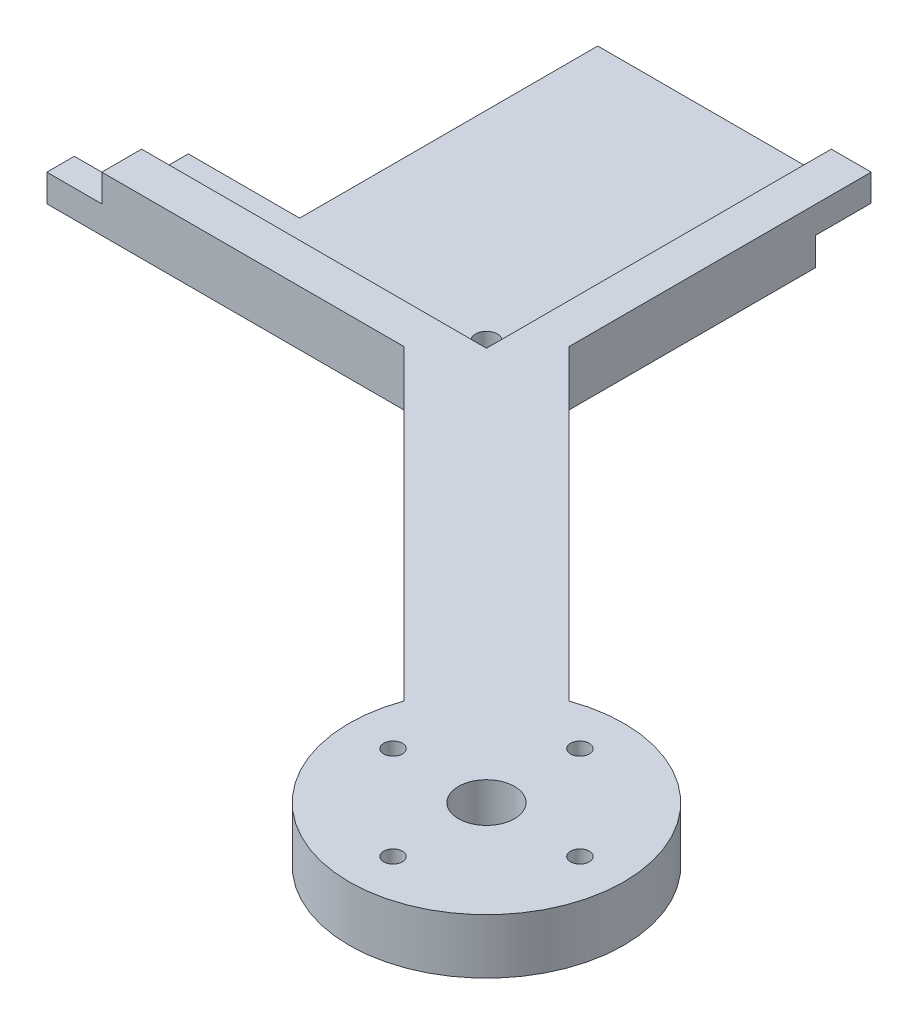
ISO-10303-21;
HEADER;
FILE_DESCRIPTION(('STEP AP214'),'2;1');
FILE_NAME('part.step','',(''),(''),'','','');
FILE_SCHEMA(('AUTOMOTIVE_DESIGN { 1 0 10303 214 1 1 1 1 }'));
ENDSEC;
DATA;
#1=APPLICATION_CONTEXT('core data for automotive mechanical design processes');
#2=APPLICATION_PROTOCOL_DEFINITION('international standard','automotive_design',2000,#1);
#3=PRODUCT_CONTEXT('',#1,'mechanical');
#4=PRODUCT('Part','Part','',(#3));
#5=PRODUCT_RELATED_PRODUCT_CATEGORY('part','',(#4));
#6=PRODUCT_DEFINITION_FORMATION('','',#4);
#7=PRODUCT_DEFINITION_CONTEXT('part definition',#1,'design');
#8=PRODUCT_DEFINITION('design','',#6,#7);
#9=PRODUCT_DEFINITION_SHAPE('','',#8);
#10=(LENGTH_UNIT() NAMED_UNIT(*) SI_UNIT(.MILLI.,.METRE.));
#11=(NAMED_UNIT(*) PLANE_ANGLE_UNIT() SI_UNIT($,.RADIAN.));
#12=(NAMED_UNIT(*) SI_UNIT($,.STERADIAN.) SOLID_ANGLE_UNIT());
#13=UNCERTAINTY_MEASURE_WITH_UNIT(LENGTH_MEASURE(1.E-05),#10,'distance_accuracy_value','');
#14=(GEOMETRIC_REPRESENTATION_CONTEXT(3) GLOBAL_UNCERTAINTY_ASSIGNED_CONTEXT((#13)) GLOBAL_UNIT_ASSIGNED_CONTEXT((#10,
#11,#12)) REPRESENTATION_CONTEXT('',''));
#15=CARTESIAN_POINT('',(0.,0.,0.));
#16=DIRECTION('',(0.,0.,1.));
#17=DIRECTION('',(1.,0.,0.));
#18=AXIS2_PLACEMENT_3D('',#15,#16,#17);
#19=CARTESIAN_POINT('',(-70.,-10.01,0.));
#20=DIRECTION('',(0.,0.,1.));
#21=DIRECTION('',(1.,0.,0.));
#22=AXIS2_PLACEMENT_3D('',#19,#20,#21);
#23=PLANE('',#22);
#24=DIRECTION('',(0.,-1.,0.));
#25=VECTOR('',#24,1.);
#26=CARTESIAN_POINT('',(70.,-10.,0.));
#27=LINE('',#26,#25);
#28=CARTESIAN_POINT('',(70.,0.,0.));
#29=VERTEX_POINT('',#28);
#30=CARTESIAN_POINT('',(70.,-4.9,0.));
#31=VERTEX_POINT('',#30);
#32=EDGE_CURVE('E326',#29,#31,#27,.T.);
#33=ORIENTED_EDGE('',*,*,#32,.T.);
#34=DIRECTION('',(1.,0.,0.));
#35=VECTOR('',#34,1.);
#36=CARTESIAN_POINT('',(70.,-4.9,0.));
#37=LINE('',#36,#35);
#38=CARTESIAN_POINT('',(64.9,-4.9,0.));
#39=VERTEX_POINT('',#38);
#40=EDGE_CURVE('E196',#39,#31,#37,.T.);
#41=ORIENTED_EDGE('',*,*,#40,.F.);
#42=DIRECTION('',(0.,1.,0.));
#43=VECTOR('',#42,1.);
#44=CARTESIAN_POINT('',(64.9,-10.,0.));
#45=LINE('',#44,#43);
#46=CARTESIAN_POINT('',(64.9,-10.,0.));
#47=VERTEX_POINT('',#46);
#48=EDGE_CURVE('E409',#47,#39,#45,.T.);
#49=ORIENTED_EDGE('',*,*,#48,.F.);
#50=DIRECTION('',(1.,0.,0.));
#51=VECTOR('',#50,1.);
#52=CARTESIAN_POINT('',(134.350288425444,-10.,0.));
#53=LINE('',#52,#51);
#54=CARTESIAN_POINT('',(30.35,-10.,0.));
#55=VERTEX_POINT('',#54);
#56=EDGE_CURVE('E337',#55,#47,#53,.T.);
#57=ORIENTED_EDGE('',*,*,#56,.F.);
#58=DIRECTION('',(0.,-1.,0.));
#59=VECTOR('',#58,1.);
#60=CARTESIAN_POINT('',(30.35,-10.,0.));
#61=LINE('',#60,#59);
#62=CARTESIAN_POINT('',(30.35,-7.4,0.));
#63=VERTEX_POINT('',#62);
#64=EDGE_CURVE('E430',#63,#55,#61,.T.);
#65=ORIENTED_EDGE('',*,*,#64,.F.);
#66=DIRECTION('',(1.,0.,0.));
#67=VECTOR('',#66,1.);
#68=CARTESIAN_POINT('',(20.25,-7.4,0.));
#69=LINE('',#68,#67);
#70=CARTESIAN_POINT('',(20.25,-7.4,0.));
#71=VERTEX_POINT('',#70);
#72=EDGE_CURVE('E440',#71,#63,#69,.T.);
#73=ORIENTED_EDGE('',*,*,#72,.F.);
#74=DIRECTION('',(0.,-1.,0.));
#75=VECTOR('',#74,1.);
#76=CARTESIAN_POINT('',(20.25,-10.,0.));
#77=LINE('',#76,#75);
#78=CARTESIAN_POINT('',(20.25,-5.,0.));
#79=VERTEX_POINT('',#78);
#80=EDGE_CURVE('E332',#79,#71,#77,.T.);
#81=ORIENTED_EDGE('',*,*,#80,.F.);
#82=DIRECTION('',(1.,0.,0.));
#83=VECTOR('',#82,1.);
#84=CARTESIAN_POINT('',(0.,-5.,0.));
#85=LINE('',#84,#83);
#86=CARTESIAN_POINT('',(62.75,-5.,0.));
#87=VERTEX_POINT('',#86);
#88=EDGE_CURVE('E43',#79,#87,#85,.T.);
#89=ORIENTED_EDGE('',*,*,#88,.T.);
#90=DIRECTION('',(0.,-1.,0.));
#91=VECTOR('',#90,1.);
#92=CARTESIAN_POINT('',(62.75,-5.,0.));
#93=LINE('',#92,#91);
#94=CARTESIAN_POINT('',(62.75,0.,0.));
#95=VERTEX_POINT('',#94);
#96=EDGE_CURVE('E345',#95,#87,#93,.T.);
#97=ORIENTED_EDGE('',*,*,#96,.F.);
#98=DIRECTION('',(1.,0.,0.));
#99=VECTOR('',#98,1.);
#100=CARTESIAN_POINT('',(134.350288425444,0.,0.));
#101=LINE('',#100,#99);
#102=EDGE_CURVE('E327',#95,#29,#101,.T.);
#103=ORIENTED_EDGE('',*,*,#102,.T.);
#104=EDGE_LOOP('',(#33,#41,#49,#57,#65,#73,#81,#89,#97,#103));
#105=FACE_BOUND('',#104,.T.);
#106=ADVANCED_FACE('F39',(#105),#23,.F.);
#107=CARTESIAN_POINT('',(0.,-10.01,-70.));
#108=DIRECTION('',(-1.,0.,0.));
#109=DIRECTION('',(0.,0.,1.));
#110=AXIS2_PLACEMENT_3D('',#107,#108,#109);
#111=PLANE('',#110);
#112=DIRECTION('',(0.,-1.,0.));
#113=VECTOR('',#112,1.);
#114=CARTESIAN_POINT('',(0.,-10.,65.));
#115=LINE('',#114,#113);
#116=CARTESIAN_POINT('',(0.,-5.,65.));
#117=VERTEX_POINT('',#116);
#118=CARTESIAN_POINT('',(0.,-10.,65.));
#119=VERTEX_POINT('',#118);
#120=EDGE_CURVE('E459',#117,#119,#115,.T.);
#121=ORIENTED_EDGE('',*,*,#120,.F.);
#122=DIRECTION('',(0.,0.,-1.));
#123=VECTOR('',#122,1.);
#124=CARTESIAN_POINT('',(0.,-5.,70.));
#125=LINE('',#124,#123);
#126=CARTESIAN_POINT('',(0.,-5.,70.));
#127=VERTEX_POINT('',#126);
#128=EDGE_CURVE('E420',#127,#117,#125,.T.);
#129=ORIENTED_EDGE('',*,*,#128,.F.);
#130=DIRECTION('',(0.,-1.,0.));
#131=VECTOR('',#130,1.);
#132=CARTESIAN_POINT('',(0.,-10.,70.));
#133=LINE('',#132,#131);
#134=CARTESIAN_POINT('',(0.,0.,70.));
#135=VERTEX_POINT('',#134);
#136=EDGE_CURVE('E333',#135,#127,#133,.T.);
#137=ORIENTED_EDGE('',*,*,#136,.F.);
#138=DIRECTION('',(0.,0.,1.));
#139=VECTOR('',#138,1.);
#140=CARTESIAN_POINT('',(0.,0.,-134.350288425444));
#141=LINE('',#140,#139);
#142=CARTESIAN_POINT('',(0.,0.,62.75));
#143=VERTEX_POINT('',#142);
#144=EDGE_CURVE('E338',#143,#135,#141,.T.);
#145=ORIENTED_EDGE('',*,*,#144,.F.);
#146=DIRECTION('',(0.,-1.,0.));
#147=VECTOR('',#146,1.);
#148=CARTESIAN_POINT('',(0.,-5.,62.75));
#149=LINE('',#148,#147);
#150=CARTESIAN_POINT('',(0.,-5.,62.75));
#151=VERTEX_POINT('',#150);
#152=EDGE_CURVE('E318',#143,#151,#149,.T.);
#153=ORIENTED_EDGE('',*,*,#152,.T.);
#154=DIRECTION('',(0.,0.,1.));
#155=VECTOR('',#154,1.);
#156=CARTESIAN_POINT('',(0.,-5.,0.));
#157=LINE('',#156,#155);
#158=CARTESIAN_POINT('',(0.,-5.,54.25));
#159=VERTEX_POINT('',#158);
#160=EDGE_CURVE('E341',#159,#151,#157,.T.);
#161=ORIENTED_EDGE('',*,*,#160,.F.);
#162=DIRECTION('',(0.,-1.,0.));
#163=VECTOR('',#162,1.);
#164=CARTESIAN_POINT('',(0.,-10.,54.25));
#165=LINE('',#164,#163);
#166=CARTESIAN_POINT('',(0.,-10.,54.25));
#167=VERTEX_POINT('',#166);
#168=EDGE_CURVE('E328',#159,#167,#165,.T.);
#169=ORIENTED_EDGE('',*,*,#168,.T.);
#170=DIRECTION('',(0.,0.,1.));
#171=VECTOR('',#170,1.);
#172=CARTESIAN_POINT('',(0.,-10.,-134.350288425444));
#173=LINE('',#172,#171);
#174=EDGE_CURVE('E323',#167,#119,#173,.T.);
#175=ORIENTED_EDGE('',*,*,#174,.T.);
#176=EDGE_LOOP('',(#121,#129,#137,#145,#153,#161,#169,#175));
#177=FACE_BOUND('',#176,.T.);
#178=ADVANCED_FACE('F504',(#177),#111,.T.);
#179=CARTESIAN_POINT('',(-20.25,-10.,54.25));
#180=DIRECTION('',(0.,0.,1.));
#181=DIRECTION('',(1.,0.,0.));
#182=AXIS2_PLACEMENT_3D('',#179,#180,#181);
#183=PLANE('',#182);
#184=ORIENTED_EDGE('',*,*,#168,.F.);
#185=DIRECTION('',(-1.,0.,0.));
#186=VECTOR('',#185,1.);
#187=CARTESIAN_POINT('',(-20.25,-5.,54.25));
#188=LINE('',#187,#186);
#189=CARTESIAN_POINT('',(20.25,-5.,54.25));
#190=VERTEX_POINT('',#189);
#191=EDGE_CURVE('E295',#190,#159,#188,.T.);
#192=ORIENTED_EDGE('',*,*,#191,.F.);
#193=DIRECTION('',(0.,1.,0.));
#194=VECTOR('',#193,1.);
#195=CARTESIAN_POINT('',(20.25,-10.,54.25));
#196=LINE('',#195,#194);
#197=CARTESIAN_POINT('',(20.25,-10.,54.25));
#198=VERTEX_POINT('',#197);
#199=EDGE_CURVE('E235',#198,#190,#196,.T.);
#200=ORIENTED_EDGE('',*,*,#199,.F.);
#201=DIRECTION('',(1.,0.,0.));
#202=VECTOR('',#201,1.);
#203=CARTESIAN_POINT('',(-20.25,-10.,54.25));
#204=LINE('',#203,#202);
#205=EDGE_CURVE('E239',#167,#198,#204,.T.);
#206=ORIENTED_EDGE('',*,*,#205,.F.);
#207=EDGE_LOOP('',(#184,#192,#200,#206));
#208=FACE_BOUND('',#207,.T.);
#209=ADVANCED_FACE('F501',(#208),#183,.F.);
#210=CARTESIAN_POINT('',(-55.,-10.,70.));
#211=DIRECTION('',(0.,0.,1.));
#212=DIRECTION('',(1.,0.,0.));
#213=AXIS2_PLACEMENT_3D('',#210,#211,#212);
#214=PLANE('',#213);
#215=DIRECTION('',(1.,0.,0.));
#216=VECTOR('',#215,1.);
#217=CARTESIAN_POINT('',(-55.,0.,70.));
#218=LINE('',#217,#216);
#219=CARTESIAN_POINT('',(55.,0.,70.));
#220=VERTEX_POINT('',#219);
#221=EDGE_CURVE('E240',#135,#220,#218,.T.);
#222=ORIENTED_EDGE('',*,*,#221,.F.);
#223=ORIENTED_EDGE('',*,*,#136,.T.);
#224=DIRECTION('',(1.,0.,0.));
#225=VECTOR('',#224,1.);
#226=CARTESIAN_POINT('',(-10.,-5.,70.));
#227=LINE('',#226,#225);
#228=CARTESIAN_POINT('',(-10.,-5.,70.));
#229=VERTEX_POINT('',#228);
#230=EDGE_CURVE('E322',#229,#127,#227,.T.);
#231=ORIENTED_EDGE('',*,*,#230,.F.);
#232=DIRECTION('',(0.,1.,0.));
#233=VECTOR('',#232,1.);
#234=CARTESIAN_POINT('',(-10.,-10.,70.));
#235=LINE('',#234,#233);
#236=CARTESIAN_POINT('',(-10.,-10.,70.));
#237=VERTEX_POINT('',#236);
#238=EDGE_CURVE('E454',#237,#229,#235,.T.);
#239=ORIENTED_EDGE('',*,*,#238,.F.);
#240=DIRECTION('',(1.,0.,0.));
#241=VECTOR('',#240,1.);
#242=CARTESIAN_POINT('',(-55.,-10.,70.));
#243=LINE('',#242,#241);
#244=CARTESIAN_POINT('',(55.,-10.,70.));
#245=VERTEX_POINT('',#244);
#246=EDGE_CURVE('E234',#237,#245,#243,.T.);
#247=ORIENTED_EDGE('',*,*,#246,.T.);
#248=DIRECTION('',(0.,1.,0.));
#249=VECTOR('',#248,1.);
#250=CARTESIAN_POINT('',(55.,-10.,70.));
#251=LINE('',#250,#249);
#252=EDGE_CURVE('E214',#245,#220,#251,.T.);
#253=ORIENTED_EDGE('',*,*,#252,.T.);
#254=EDGE_LOOP('',(#222,#223,#231,#239,#247,#253));
#255=FACE_BOUND('',#254,.T.);
#256=ADVANCED_FACE('F517',(#255),#214,.T.);
#257=CARTESIAN_POINT('',(134.350288425444,-10.,-134.350288425444));
#258=DIRECTION('',(0.,1.,0.));
#259=DIRECTION('',(0.,0.,1.));
#260=AXIS2_PLACEMENT_3D('',#257,#258,#259);
#261=PLANE('',#260);
#262=CARTESIAN_POINT('',(56.4999999999999,-10.,56.5));
#263=DIRECTION('',(0.,1.,0.));
#264=DIRECTION('',(0.,0.,1.));
#265=AXIS2_PLACEMENT_3D('',#262,#263,#264);
#266=CIRCLE('',#265,2.00000000000045);
#267=CARTESIAN_POINT('',(56.4999999999999,-10.,58.5000000000004));
#268=VERTEX_POINT('',#267);
#269=EDGE_CURVE('E245',#268,#268,#266,.T.);
#270=ORIENTED_EDGE('',*,*,#269,.T.);
#271=EDGE_LOOP('',(#270));
#272=FACE_BOUND('',#271,.T.);
#273=CARTESIAN_POINT('',(117.350288425444,-10.,134.350288425444));
#274=DIRECTION('',(0.,1.,0.));
#275=DIRECTION('',(0.,0.,1.));
#276=AXIS2_PLACEMENT_3D('',#273,#274,#275);
#277=CIRCLE('',#276,1.7);
#278=CARTESIAN_POINT('',(117.350288425444,-10.,136.050288425444));
#279=VERTEX_POINT('',#278);
#280=EDGE_CURVE('E249',#279,#279,#277,.T.);
#281=ORIENTED_EDGE('',*,*,#280,.T.);
#282=EDGE_LOOP('',(#281));
#283=FACE_BOUND('',#282,.T.);
#284=CARTESIAN_POINT('',(134.350288425444,-10.,117.350288425444));
#285=DIRECTION('',(0.,1.,0.));
#286=DIRECTION('',(0.,0.,1.));
#287=AXIS2_PLACEMENT_3D('',#284,#285,#286);
#288=CIRCLE('',#287,1.70000000000001);
#289=CARTESIAN_POINT('',(134.350288425444,-10.,119.050288425444));
#290=VERTEX_POINT('',#289);
#291=EDGE_CURVE('E254',#290,#290,#288,.T.);
#292=ORIENTED_EDGE('',*,*,#291,.T.);
#293=EDGE_LOOP('',(#292));
#294=FACE_BOUND('',#293,.T.);
#295=CARTESIAN_POINT('',(134.350288425444,-10.,151.350288425444));
#296=DIRECTION('',(0.,1.,0.));
#297=DIRECTION('',(0.,0.,1.));
#298=AXIS2_PLACEMENT_3D('',#295,#296,#297);
#299=CIRCLE('',#298,1.70000000000001);
#300=CARTESIAN_POINT('',(134.350288425444,-10.,153.050288425444));
#301=VERTEX_POINT('',#300);
#302=EDGE_CURVE('E262',#301,#301,#299,.T.);
#303=ORIENTED_EDGE('',*,*,#302,.T.);
#304=EDGE_LOOP('',(#303));
#305=FACE_BOUND('',#304,.T.);
#306=CARTESIAN_POINT('',(151.350288425444,-10.,134.350288425444));
#307=DIRECTION('',(0.,1.,0.));
#308=DIRECTION('',(0.,0.,1.));
#309=AXIS2_PLACEMENT_3D('',#306,#307,#308);
#310=CIRCLE('',#309,1.70000000000001);
#311=CARTESIAN_POINT('',(151.350288425444,-10.,136.050288425444));
#312=VERTEX_POINT('',#311);
#313=EDGE_CURVE('E270',#312,#312,#310,.T.);
#314=ORIENTED_EDGE('',*,*,#313,.T.);
#315=EDGE_LOOP('',(#314));
#316=FACE_BOUND('',#315,.T.);
#317=CARTESIAN_POINT('',(134.350288425444,-10.,134.350288425444));
#318=DIRECTION('',(0.,1.,0.));
#319=DIRECTION('',(0.,0.,1.));
#320=AXIS2_PLACEMENT_3D('',#317,#318,#319);
#321=CIRCLE('',#320,5.09999999999998);
#322=CARTESIAN_POINT('',(134.350288425444,-10.,139.450288425444));
#323=VERTEX_POINT('',#322);
#324=EDGE_CURVE('E278',#323,#323,#321,.T.);
#325=ORIENTED_EDGE('',*,*,#324,.T.);
#326=EDGE_LOOP('',(#325));
#327=FACE_BOUND('',#326,.T.);
#328=ORIENTED_EDGE('',*,*,#56,.T.);
#329=DIRECTION('',(0.,0.,-1.));
#330=VECTOR('',#329,1.);
#331=CARTESIAN_POINT('',(64.9,-10.,10.1));
#332=LINE('',#331,#330);
#333=CARTESIAN_POINT('',(64.9,-10.,10.1));
#334=VERTEX_POINT('',#333);
#335=EDGE_CURVE('E205',#334,#47,#332,.T.);
#336=ORIENTED_EDGE('',*,*,#335,.F.);
#337=DIRECTION('',(-1.,0.,0.));
#338=VECTOR('',#337,1.);
#339=CARTESIAN_POINT('',(70.,-10.,10.1));
#340=LINE('',#339,#338);
#341=CARTESIAN_POINT('',(70.,-10.,10.1));
#342=VERTEX_POINT('',#341);
#343=EDGE_CURVE('E190',#342,#334,#340,.T.);
#344=ORIENTED_EDGE('',*,*,#343,.F.);
#345=DIRECTION('',(0.,0.,-1.));
#346=VECTOR('',#345,1.);
#347=CARTESIAN_POINT('',(70.,-10.,-55.));
#348=LINE('',#347,#346);
#349=CARTESIAN_POINT('',(70.,-10.,55.));
#350=VERTEX_POINT('',#349);
#351=EDGE_CURVE('E203',#350,#342,#348,.T.);
#352=ORIENTED_EDGE('',*,*,#351,.F.);
#353=DIRECTION('',(-0.707106781186547,0.,-0.707106781186548));
#354=VECTOR('',#353,1.);
#355=CARTESIAN_POINT('',(70.,-10.,55.));
#356=LINE('',#355,#354);
#357=CARTESIAN_POINT('',(125.842477831862,-10.,110.842477831862));
#358=VERTEX_POINT('',#357);
#359=EDGE_CURVE('E213',#358,#350,#356,.T.);
#360=ORIENTED_EDGE('',*,*,#359,.F.);
#361=CARTESIAN_POINT('',(134.350288425444,-10.,134.350288425444));
#362=DIRECTION('',(0.,1.,0.));
#363=DIRECTION('',(0.,0.,1.));
#364=AXIS2_PLACEMENT_3D('',#361,#362,#363);
#365=CIRCLE('',#364,25.);
#366=CARTESIAN_POINT('',(110.842477831862,-10.,125.842477831862));
#367=VERTEX_POINT('',#366);
#368=EDGE_CURVE('E218',#367,#358,#365,.T.);
#369=ORIENTED_EDGE('',*,*,#368,.F.);
#370=DIRECTION('',(0.707106781186547,0.,0.707106781186547));
#371=VECTOR('',#370,1.);
#372=CARTESIAN_POINT('',(55.,-10.,70.));
#373=LINE('',#372,#371);
#374=EDGE_CURVE('E230',#245,#367,#373,.T.);
#375=ORIENTED_EDGE('',*,*,#374,.F.);
#376=ORIENTED_EDGE('',*,*,#246,.F.);
#377=DIRECTION('',(0.,0.,1.));
#378=VECTOR('',#377,1.);
#379=CARTESIAN_POINT('',(-10.,-10.,70.));
#380=LINE('',#379,#378);
#381=CARTESIAN_POINT('',(-10.,-10.,65.));
#382=VERTEX_POINT('',#381);
#383=EDGE_CURVE('E465',#382,#237,#380,.T.);
#384=ORIENTED_EDGE('',*,*,#383,.F.);
#385=DIRECTION('',(1.,0.,0.));
#386=VECTOR('',#385,1.);
#387=CARTESIAN_POINT('',(-10.,-10.,65.));
#388=LINE('',#387,#386);
#389=EDGE_CURVE('E469',#382,#119,#388,.T.);
#390=ORIENTED_EDGE('',*,*,#389,.T.);
#391=ORIENTED_EDGE('',*,*,#174,.F.);
#392=ORIENTED_EDGE('',*,*,#205,.T.);
#393=DIRECTION('',(0.,0.,-1.));
#394=VECTOR('',#393,1.);
#395=CARTESIAN_POINT('',(20.25,-10.,-54.25));
#396=LINE('',#395,#394);
#397=CARTESIAN_POINT('',(20.25,-10.,10.1));
#398=VERTEX_POINT('',#397);
#399=EDGE_CURVE('E241',#198,#398,#396,.T.);
#400=ORIENTED_EDGE('',*,*,#399,.T.);
#401=DIRECTION('',(-1.,0.,0.));
#402=VECTOR('',#401,1.);
#403=CARTESIAN_POINT('',(20.25,-10.,10.1));
#404=LINE('',#403,#402);
#405=CARTESIAN_POINT('',(30.35,-10.,10.1));
#406=VERTEX_POINT('',#405);
#407=EDGE_CURVE('E57',#406,#398,#404,.T.);
#408=ORIENTED_EDGE('',*,*,#407,.F.);
#409=DIRECTION('',(0.,0.,-1.));
#410=VECTOR('',#409,1.);
#411=CARTESIAN_POINT('',(30.35,-10.,10.1));
#412=LINE('',#411,#410);
#413=EDGE_CURVE('E414',#406,#55,#412,.T.);
#414=ORIENTED_EDGE('',*,*,#413,.T.);
#415=EDGE_LOOP('',(#328,#336,#344,#352,#360,#369,#375,#376,#384,#390,#391,#392,#400,#408,#414));
#416=FACE_BOUND('',#415,.T.);
#417=ADVANCED_FACE('F201',(#272,#283,#294,#305,#316,#327,#416),#261,.F.);
#418=CARTESIAN_POINT('',(134.350288425444,0.,-134.350288425444));
#419=DIRECTION('',(0.,1.,0.));
#420=DIRECTION('',(0.,0.,1.));
#421=AXIS2_PLACEMENT_3D('',#418,#419,#420);
#422=PLANE('',#421);
#423=CARTESIAN_POINT('',(117.350288425444,0.,134.350288425444));
#424=DIRECTION('',(0.,1.,0.));
#425=DIRECTION('',(0.,0.,1.));
#426=AXIS2_PLACEMENT_3D('',#423,#424,#425);
#427=CIRCLE('',#426,1.7);
#428=CARTESIAN_POINT('',(117.350288425444,0.,136.050288425444));
#429=VERTEX_POINT('',#428);
#430=EDGE_CURVE('E250',#429,#429,#427,.T.);
#431=ORIENTED_EDGE('',*,*,#430,.F.);
#432=EDGE_LOOP('',(#431));
#433=FACE_BOUND('',#432,.T.);
#434=CARTESIAN_POINT('',(134.350288425444,0.,117.350288425444));
#435=DIRECTION('',(0.,1.,0.));
#436=DIRECTION('',(0.,0.,1.));
#437=AXIS2_PLACEMENT_3D('',#434,#435,#436);
#438=CIRCLE('',#437,1.70000000000001);
#439=CARTESIAN_POINT('',(134.350288425444,0.,119.050288425444));
#440=VERTEX_POINT('',#439);
#441=EDGE_CURVE('E258',#440,#440,#438,.T.);
#442=ORIENTED_EDGE('',*,*,#441,.F.);
#443=EDGE_LOOP('',(#442));
#444=FACE_BOUND('',#443,.T.);
#445=CARTESIAN_POINT('',(134.350288425444,0.,151.350288425444));
#446=DIRECTION('',(0.,1.,0.));
#447=DIRECTION('',(0.,0.,1.));
#448=AXIS2_PLACEMENT_3D('',#445,#446,#447);
#449=CIRCLE('',#448,1.70000000000001);
#450=CARTESIAN_POINT('',(134.350288425444,0.,153.050288425444));
#451=VERTEX_POINT('',#450);
#452=EDGE_CURVE('E266',#451,#451,#449,.T.);
#453=ORIENTED_EDGE('',*,*,#452,.F.);
#454=EDGE_LOOP('',(#453));
#455=FACE_BOUND('',#454,.T.);
#456=CARTESIAN_POINT('',(151.350288425444,0.,134.350288425444));
#457=DIRECTION('',(0.,1.,0.));
#458=DIRECTION('',(0.,0.,1.));
#459=AXIS2_PLACEMENT_3D('',#456,#457,#458);
#460=CIRCLE('',#459,1.70000000000001);
#461=CARTESIAN_POINT('',(151.350288425444,0.,136.050288425444));
#462=VERTEX_POINT('',#461);
#463=EDGE_CURVE('E274',#462,#462,#460,.T.);
#464=ORIENTED_EDGE('',*,*,#463,.F.);
#465=EDGE_LOOP('',(#464));
#466=FACE_BOUND('',#465,.T.);
#467=CARTESIAN_POINT('',(134.350288425444,0.,134.350288425444));
#468=DIRECTION('',(0.,1.,0.));
#469=DIRECTION('',(0.,0.,1.));
#470=AXIS2_PLACEMENT_3D('',#467,#468,#469);
#471=CIRCLE('',#470,5.09999999999998);
#472=CARTESIAN_POINT('',(134.350288425444,0.,139.450288425444));
#473=VERTEX_POINT('',#472);
#474=EDGE_CURVE('E282',#473,#473,#471,.T.);
#475=ORIENTED_EDGE('',*,*,#474,.F.);
#476=EDGE_LOOP('',(#475));
#477=FACE_BOUND('',#476,.T.);
#478=DIRECTION('',(1.,0.,0.));
#479=VECTOR('',#478,1.);
#480=CARTESIAN_POINT('',(-62.75,0.,62.75));
#481=LINE('',#480,#479);
#482=CARTESIAN_POINT('',(62.75,0.,62.75));
#483=VERTEX_POINT('',#482);
#484=EDGE_CURVE('E49',#143,#483,#481,.T.);
#485=ORIENTED_EDGE('',*,*,#484,.F.);
#486=ORIENTED_EDGE('',*,*,#144,.T.);
#487=ORIENTED_EDGE('',*,*,#221,.T.);
#488=DIRECTION('',(0.707106781186547,0.,0.707106781186547));
#489=VECTOR('',#488,1.);
#490=CARTESIAN_POINT('',(55.,0.,70.));
#491=LINE('',#490,#489);
#492=CARTESIAN_POINT('',(110.842477831862,0.,125.842477831862));
#493=VERTEX_POINT('',#492);
#494=EDGE_CURVE('E224',#220,#493,#491,.T.);
#495=ORIENTED_EDGE('',*,*,#494,.T.);
#496=CARTESIAN_POINT('',(134.350288425444,0.,134.350288425444));
#497=DIRECTION('',(0.,1.,0.));
#498=DIRECTION('',(0.,0.,1.));
#499=AXIS2_PLACEMENT_3D('',#496,#497,#498);
#500=CIRCLE('',#499,25.);
#501=CARTESIAN_POINT('',(125.842477831862,0.,110.842477831862));
#502=VERTEX_POINT('',#501);
#503=EDGE_CURVE('E384',#493,#502,#500,.T.);
#504=ORIENTED_EDGE('',*,*,#503,.T.);
#505=DIRECTION('',(-0.707106781186547,0.,-0.707106781186548));
#506=VECTOR('',#505,1.);
#507=CARTESIAN_POINT('',(70.,0.,55.));
#508=LINE('',#507,#506);
#509=CARTESIAN_POINT('',(70.,0.,55.));
#510=VERTEX_POINT('',#509);
#511=EDGE_CURVE('E381',#502,#510,#508,.T.);
#512=ORIENTED_EDGE('',*,*,#511,.T.);
#513=DIRECTION('',(0.,0.,-1.));
#514=VECTOR('',#513,1.);
#515=CARTESIAN_POINT('',(70.,0.,-55.));
#516=LINE('',#515,#514);
#517=EDGE_CURVE('E317',#510,#29,#516,.T.);
#518=ORIENTED_EDGE('',*,*,#517,.T.);
#519=ORIENTED_EDGE('',*,*,#102,.F.);
#520=DIRECTION('',(0.,0.,-1.));
#521=VECTOR('',#520,1.);
#522=CARTESIAN_POINT('',(62.75,0.,-62.75));
#523=LINE('',#522,#521);
#524=EDGE_CURVE('E11',#483,#95,#523,.T.);
#525=ORIENTED_EDGE('',*,*,#524,.F.);
#526=EDGE_LOOP('',(#485,#486,#487,#495,#504,#512,#518,#519,#525));
#527=FACE_BOUND('',#526,.T.);
#528=ADVANCED_FACE('F392',(#433,#444,#455,#466,#477,#527),#422,.T.);
#529=CARTESIAN_POINT('',(0.,-5.,0.));
#530=DIRECTION('',(0.,1.,0.));
#531=DIRECTION('',(0.,0.,1.));
#532=AXIS2_PLACEMENT_3D('',#529,#530,#531);
#533=PLANE('',#532);
#534=CARTESIAN_POINT('',(56.4999999999999,-5.,56.5));
#535=DIRECTION('',(0.,1.,0.));
#536=DIRECTION('',(0.,0.,1.));
#537=AXIS2_PLACEMENT_3D('',#534,#535,#536);
#538=CIRCLE('',#537,2.00000000000045);
#539=CARTESIAN_POINT('',(56.4999999999999,-5.,58.5000000000004));
#540=VERTEX_POINT('',#539);
#541=EDGE_CURVE('E290',#540,#540,#538,.F.);
#542=ORIENTED_EDGE('',*,*,#541,.T.);
#543=EDGE_LOOP('',(#542));
#544=FACE_BOUND('',#543,.T.);
#545=ORIENTED_EDGE('',*,*,#191,.T.);
#546=ORIENTED_EDGE('',*,*,#160,.T.);
#547=DIRECTION('',(1.,0.,0.));
#548=VECTOR('',#547,1.);
#549=CARTESIAN_POINT('',(-62.75,-5.,62.75));
#550=LINE('',#549,#548);
#551=CARTESIAN_POINT('',(62.75,-5.,62.75));
#552=VERTEX_POINT('',#551);
#553=EDGE_CURVE('E298',#151,#552,#550,.T.);
#554=ORIENTED_EDGE('',*,*,#553,.T.);
#555=DIRECTION('',(0.,0.,-1.));
#556=VECTOR('',#555,1.);
#557=CARTESIAN_POINT('',(62.75,-5.,-62.75));
#558=LINE('',#557,#556);
#559=EDGE_CURVE('E300',#552,#87,#558,.T.);
#560=ORIENTED_EDGE('',*,*,#559,.T.);
#561=ORIENTED_EDGE('',*,*,#88,.F.);
#562=DIRECTION('',(0.,0.,1.));
#563=VECTOR('',#562,1.);
#564=CARTESIAN_POINT('',(20.25,-5.,-54.25));
#565=LINE('',#564,#563);
#566=EDGE_CURVE('E286',#79,#190,#565,.T.);
#567=ORIENTED_EDGE('',*,*,#566,.T.);
#568=EDGE_LOOP('',(#545,#546,#554,#560,#561,#567));
#569=FACE_BOUND('',#568,.T.);
#570=ADVANCED_FACE('F41',(#544,#569),#533,.T.);
#571=CARTESIAN_POINT('',(-62.75,-5.,62.75));
#572=DIRECTION('',(0.,0.,1.));
#573=DIRECTION('',(1.,0.,0.));
#574=AXIS2_PLACEMENT_3D('',#571,#572,#573);
#575=PLANE('',#574);
#576=ORIENTED_EDGE('',*,*,#152,.F.);
#577=ORIENTED_EDGE('',*,*,#484,.T.);
#578=DIRECTION('',(0.,1.,0.));
#579=VECTOR('',#578,1.);
#580=CARTESIAN_POINT('',(62.75,-5.,62.75));
#581=LINE('',#580,#579);
#582=EDGE_CURVE('E294',#552,#483,#581,.T.);
#583=ORIENTED_EDGE('',*,*,#582,.F.);
#584=ORIENTED_EDGE('',*,*,#553,.F.);
#585=EDGE_LOOP('',(#576,#577,#583,#584));
#586=FACE_BOUND('',#585,.T.);
#587=ADVANCED_FACE('F521',(#586),#575,.F.);
#588=CARTESIAN_POINT('',(20.25,-10.,-54.25));
#589=DIRECTION('',(1.,0.,0.));
#590=DIRECTION('',(0.,0.,-1.));
#591=AXIS2_PLACEMENT_3D('',#588,#589,#590);
#592=PLANE('',#591);
#593=ORIENTED_EDGE('',*,*,#80,.T.);
#594=DIRECTION('',(0.,0.,-1.));
#595=VECTOR('',#594,1.);
#596=CARTESIAN_POINT('',(20.25,-7.4,10.1));
#597=LINE('',#596,#595);
#598=CARTESIAN_POINT('',(20.25,-7.4,10.1));
#599=VERTEX_POINT('',#598);
#600=EDGE_CURVE('E439',#599,#71,#597,.T.);
#601=ORIENTED_EDGE('',*,*,#600,.F.);
#602=DIRECTION('',(0.,1.,0.));
#603=VECTOR('',#602,1.);
#604=CARTESIAN_POINT('',(20.25,-10.,10.1));
#605=LINE('',#604,#603);
#606=EDGE_CURVE('E426',#398,#599,#605,.T.);
#607=ORIENTED_EDGE('',*,*,#606,.F.);
#608=ORIENTED_EDGE('',*,*,#399,.F.);
#609=ORIENTED_EDGE('',*,*,#199,.T.);
#610=ORIENTED_EDGE('',*,*,#566,.F.);
#611=EDGE_LOOP('',(#593,#601,#607,#608,#609,#610));
#612=FACE_BOUND('',#611,.T.);
#613=ADVANCED_FACE('F494',(#612),#592,.F.);
#614=CARTESIAN_POINT('',(56.4999999999999,-10.,56.5));
#615=DIRECTION('',(0.,1.,0.));
#616=DIRECTION('',(0.,0.,1.));
#617=AXIS2_PLACEMENT_3D('',#614,#615,#616);
#618=CYLINDRICAL_SURFACE('',#617,2.00000000000045);
#619=ORIENTED_EDGE('',*,*,#269,.F.);
#620=EDGE_LOOP('',(#619));
#621=FACE_BOUND('',#620,.T.);
#622=ORIENTED_EDGE('',*,*,#541,.F.);
#623=EDGE_LOOP('',(#622));
#624=FACE_BOUND('',#623,.T.);
#625=ADVANCED_FACE('F528',(#621,#624),#618,.F.);
#626=CARTESIAN_POINT('',(70.,-10.,-55.));
#627=DIRECTION('',(1.,0.,0.));
#628=DIRECTION('',(0.,0.,-1.));
#629=AXIS2_PLACEMENT_3D('',#626,#627,#628);
#630=PLANE('',#629);
#631=DIRECTION('',(0.,0.,-1.));
#632=VECTOR('',#631,1.);
#633=CARTESIAN_POINT('',(70.,-4.9,10.1));
#634=LINE('',#633,#632);
#635=CARTESIAN_POINT('',(70.,-4.9,10.1));
#636=VERTEX_POINT('',#635);
#637=EDGE_CURVE('E404',#636,#31,#634,.T.);
#638=ORIENTED_EDGE('',*,*,#637,.T.);
#639=ORIENTED_EDGE('',*,*,#32,.F.);
#640=ORIENTED_EDGE('',*,*,#517,.F.);
#641=DIRECTION('',(0.,1.,0.));
#642=VECTOR('',#641,1.);
#643=CARTESIAN_POINT('',(70.,-10.,55.));
#644=LINE('',#643,#642);
#645=EDGE_CURVE('E211',#350,#510,#644,.T.);
#646=ORIENTED_EDGE('',*,*,#645,.F.);
#647=ORIENTED_EDGE('',*,*,#351,.T.);
#648=DIRECTION('',(0.,-1.,0.));
#649=VECTOR('',#648,1.);
#650=CARTESIAN_POINT('',(70.,-10.,10.1));
#651=LINE('',#650,#649);
#652=EDGE_CURVE('E187',#636,#342,#651,.T.);
#653=ORIENTED_EDGE('',*,*,#652,.F.);
#654=EDGE_LOOP('',(#638,#639,#640,#646,#647,#653));
#655=FACE_BOUND('',#654,.T.);
#656=ADVANCED_FACE('F209',(#655),#630,.T.);
#657=CARTESIAN_POINT('',(70.,-10.,55.));
#658=DIRECTION('',(0.707106781186548,0.,-0.707106781186547));
#659=DIRECTION('',(-0.707106781186547,0.,-0.707106781186548));
#660=AXIS2_PLACEMENT_3D('',#657,#658,#659);
#661=PLANE('',#660);
#662=ORIENTED_EDGE('',*,*,#511,.F.);
#663=DIRECTION('',(0.,1.,0.));
#664=VECTOR('',#663,1.);
#665=CARTESIAN_POINT('',(125.842477831862,-10.,110.842477831862));
#666=LINE('',#665,#664);
#667=EDGE_CURVE('E370',#358,#502,#666,.T.);
#668=ORIENTED_EDGE('',*,*,#667,.F.);
#669=ORIENTED_EDGE('',*,*,#359,.T.);
#670=ORIENTED_EDGE('',*,*,#645,.T.);
#671=EDGE_LOOP('',(#662,#668,#669,#670));
#672=FACE_BOUND('',#671,.T.);
#673=ADVANCED_FACE('F403',(#672),#661,.T.);
#674=CARTESIAN_POINT('',(134.350288425444,-10.,134.350288425444));
#675=DIRECTION('',(0.,1.,0.));
#676=DIRECTION('',(0.,0.,1.));
#677=AXIS2_PLACEMENT_3D('',#674,#675,#676);
#678=CYLINDRICAL_SURFACE('',#677,25.);
#679=ORIENTED_EDGE('',*,*,#503,.F.);
#680=DIRECTION('',(0.,1.,0.));
#681=VECTOR('',#680,1.);
#682=CARTESIAN_POINT('',(110.842477831862,-10.,125.842477831862));
#683=LINE('',#682,#681);
#684=EDGE_CURVE('E221',#367,#493,#683,.T.);
#685=ORIENTED_EDGE('',*,*,#684,.F.);
#686=ORIENTED_EDGE('',*,*,#368,.T.);
#687=ORIENTED_EDGE('',*,*,#667,.T.);
#688=EDGE_LOOP('',(#679,#685,#686,#687));
#689=FACE_BOUND('',#688,.T.);
#690=ADVANCED_FACE('F400',(#689),#678,.T.);
#691=CARTESIAN_POINT('',(55.,-10.,70.));
#692=DIRECTION('',(-0.707106781186548,0.,0.707106781186548));
#693=DIRECTION('',(0.707106781186548,0.,0.707106781186548));
#694=AXIS2_PLACEMENT_3D('',#691,#692,#693);
#695=PLANE('',#694);
#696=ORIENTED_EDGE('',*,*,#494,.F.);
#697=ORIENTED_EDGE('',*,*,#252,.F.);
#698=ORIENTED_EDGE('',*,*,#374,.T.);
#699=ORIENTED_EDGE('',*,*,#684,.T.);
#700=EDGE_LOOP('',(#696,#697,#698,#699));
#701=FACE_BOUND('',#700,.T.);
#702=ADVANCED_FACE('F396',(#701),#695,.T.);
#703=CARTESIAN_POINT('',(117.350288425444,-10.,134.350288425444));
#704=DIRECTION('',(0.,1.,0.));
#705=DIRECTION('',(0.,0.,1.));
#706=AXIS2_PLACEMENT_3D('',#703,#704,#705);
#707=CYLINDRICAL_SURFACE('',#706,1.7);
#708=ORIENTED_EDGE('',*,*,#280,.F.);
#709=EDGE_LOOP('',(#708));
#710=FACE_BOUND('',#709,.T.);
#711=ORIENTED_EDGE('',*,*,#430,.T.);
#712=EDGE_LOOP('',(#711));
#713=FACE_BOUND('',#712,.T.);
#714=ADVANCED_FACE('F559',(#710,#713),#707,.F.);
#715=CARTESIAN_POINT('',(134.350288425444,-10.,117.350288425444));
#716=DIRECTION('',(0.,1.,0.));
#717=DIRECTION('',(0.,0.,1.));
#718=AXIS2_PLACEMENT_3D('',#715,#716,#717);
#719=CYLINDRICAL_SURFACE('',#718,1.70000000000001);
#720=ORIENTED_EDGE('',*,*,#291,.F.);
#721=EDGE_LOOP('',(#720));
#722=FACE_BOUND('',#721,.T.);
#723=ORIENTED_EDGE('',*,*,#441,.T.);
#724=EDGE_LOOP('',(#723));
#725=FACE_BOUND('',#724,.T.);
#726=ADVANCED_FACE('F571',(#722,#725),#719,.F.);
#727=CARTESIAN_POINT('',(134.350288425444,-10.,151.350288425444));
#728=DIRECTION('',(0.,1.,0.));
#729=DIRECTION('',(0.,0.,1.));
#730=AXIS2_PLACEMENT_3D('',#727,#728,#729);
#731=CYLINDRICAL_SURFACE('',#730,1.70000000000001);
#732=ORIENTED_EDGE('',*,*,#302,.F.);
#733=EDGE_LOOP('',(#732));
#734=FACE_BOUND('',#733,.T.);
#735=ORIENTED_EDGE('',*,*,#452,.T.);
#736=EDGE_LOOP('',(#735));
#737=FACE_BOUND('',#736,.T.);
#738=ADVANCED_FACE('F575',(#734,#737),#731,.F.);
#739=CARTESIAN_POINT('',(151.350288425444,-10.,134.350288425444));
#740=DIRECTION('',(0.,1.,0.));
#741=DIRECTION('',(0.,0.,1.));
#742=AXIS2_PLACEMENT_3D('',#739,#740,#741);
#743=CYLINDRICAL_SURFACE('',#742,1.70000000000001);
#744=ORIENTED_EDGE('',*,*,#313,.F.);
#745=EDGE_LOOP('',(#744));
#746=FACE_BOUND('',#745,.T.);
#747=ORIENTED_EDGE('',*,*,#463,.T.);
#748=EDGE_LOOP('',(#747));
#749=FACE_BOUND('',#748,.T.);
#750=ADVANCED_FACE('F579',(#746,#749),#743,.F.);
#751=CARTESIAN_POINT('',(134.350288425444,-10.,134.350288425444));
#752=DIRECTION('',(0.,1.,0.));
#753=DIRECTION('',(0.,0.,1.));
#754=AXIS2_PLACEMENT_3D('',#751,#752,#753);
#755=CYLINDRICAL_SURFACE('',#754,5.09999999999998);
#756=ORIENTED_EDGE('',*,*,#324,.F.);
#757=EDGE_LOOP('',(#756));
#758=FACE_BOUND('',#757,.T.);
#759=ORIENTED_EDGE('',*,*,#474,.T.);
#760=EDGE_LOOP('',(#759));
#761=FACE_BOUND('',#760,.T.);
#762=ADVANCED_FACE('F554',(#758,#761),#755,.F.);
#763=CARTESIAN_POINT('',(62.75,-5.,-62.75));
#764=DIRECTION('',(1.,0.,0.));
#765=DIRECTION('',(0.,0.,-1.));
#766=AXIS2_PLACEMENT_3D('',#763,#764,#765);
#767=PLANE('',#766);
#768=ORIENTED_EDGE('',*,*,#524,.T.);
#769=ORIENTED_EDGE('',*,*,#96,.T.);
#770=ORIENTED_EDGE('',*,*,#559,.F.);
#771=ORIENTED_EDGE('',*,*,#582,.T.);
#772=EDGE_LOOP('',(#768,#769,#770,#771));
#773=FACE_BOUND('',#772,.T.);
#774=ADVANCED_FACE('F365',(#773),#767,.F.);
#775=CARTESIAN_POINT('',(-10.,-5.,70.));
#776=DIRECTION('',(0.,-1.,0.));
#777=DIRECTION('',(0.,0.,-1.));
#778=AXIS2_PLACEMENT_3D('',#775,#776,#777);
#779=PLANE('',#778);
#780=ORIENTED_EDGE('',*,*,#128,.T.);
#781=DIRECTION('',(1.,0.,0.));
#782=VECTOR('',#781,1.);
#783=CARTESIAN_POINT('',(-10.,-5.,65.));
#784=LINE('',#783,#782);
#785=CARTESIAN_POINT('',(-10.,-5.,65.));
#786=VERTEX_POINT('',#785);
#787=EDGE_CURVE('E479',#786,#117,#784,.T.);
#788=ORIENTED_EDGE('',*,*,#787,.F.);
#789=DIRECTION('',(0.,0.,-1.));
#790=VECTOR('',#789,1.);
#791=CARTESIAN_POINT('',(-10.,-5.,70.));
#792=LINE('',#791,#790);
#793=EDGE_CURVE('E458',#229,#786,#792,.T.);
#794=ORIENTED_EDGE('',*,*,#793,.F.);
#795=ORIENTED_EDGE('',*,*,#230,.T.);
#796=EDGE_LOOP('',(#780,#788,#794,#795));
#797=FACE_BOUND('',#796,.T.);
#798=ADVANCED_FACE('F513',(#797),#779,.F.);
#799=CARTESIAN_POINT('',(-10.,-10.,65.));
#800=DIRECTION('',(0.,0.,1.));
#801=DIRECTION('',(1.,0.,0.));
#802=AXIS2_PLACEMENT_3D('',#799,#800,#801);
#803=PLANE('',#802);
#804=ORIENTED_EDGE('',*,*,#120,.T.);
#805=ORIENTED_EDGE('',*,*,#389,.F.);
#806=DIRECTION('',(0.,-1.,0.));
#807=VECTOR('',#806,1.);
#808=CARTESIAN_POINT('',(-10.,-10.,65.));
#809=LINE('',#808,#807);
#810=EDGE_CURVE('E462',#786,#382,#809,.T.);
#811=ORIENTED_EDGE('',*,*,#810,.F.);
#812=ORIENTED_EDGE('',*,*,#787,.T.);
#813=EDGE_LOOP('',(#804,#805,#811,#812));
#814=FACE_BOUND('',#813,.T.);
#815=ADVANCED_FACE('F509',(#814),#803,.F.);
#816=CARTESIAN_POINT('',(-10.,0.,0.));
#817=DIRECTION('',(-1.,0.,0.));
#818=DIRECTION('',(0.,0.,1.));
#819=AXIS2_PLACEMENT_3D('',#816,#817,#818);
#820=PLANE('',#819);
#821=ORIENTED_EDGE('',*,*,#238,.T.);
#822=ORIENTED_EDGE('',*,*,#793,.T.);
#823=ORIENTED_EDGE('',*,*,#810,.T.);
#824=ORIENTED_EDGE('',*,*,#383,.T.);
#825=EDGE_LOOP('',(#821,#822,#823,#824));
#826=FACE_BOUND('',#825,.T.);
#827=ADVANCED_FACE('F552',(#826),#820,.T.);
#828=CARTESIAN_POINT('',(70.,-4.9,10.1));
#829=DIRECTION('',(0.,1.,0.));
#830=DIRECTION('',(0.,0.,1.));
#831=AXIS2_PLACEMENT_3D('',#828,#829,#830);
#832=PLANE('',#831);
#833=ORIENTED_EDGE('',*,*,#40,.T.);
#834=ORIENTED_EDGE('',*,*,#637,.F.);
#835=DIRECTION('',(1.,0.,0.));
#836=VECTOR('',#835,1.);
#837=CARTESIAN_POINT('',(70.,-4.9,10.1));
#838=LINE('',#837,#836);
#839=CARTESIAN_POINT('',(64.9,-4.9,10.1));
#840=VERTEX_POINT('',#839);
#841=EDGE_CURVE('E65',#840,#636,#838,.T.);
#842=ORIENTED_EDGE('',*,*,#841,.F.);
#843=DIRECTION('',(0.,0.,-1.));
#844=VECTOR('',#843,1.);
#845=CARTESIAN_POINT('',(64.9,-4.9,10.1));
#846=LINE('',#845,#844);
#847=EDGE_CURVE('E421',#840,#39,#846,.T.);
#848=ORIENTED_EDGE('',*,*,#847,.T.);
#849=EDGE_LOOP('',(#833,#834,#842,#848));
#850=FACE_BOUND('',#849,.T.);
#851=ADVANCED_FACE('F651',(#850),#832,.F.);
#852=CARTESIAN_POINT('',(64.9,-10.,10.1));
#853=DIRECTION('',(-1.,0.,0.));
#854=DIRECTION('',(0.,0.,1.));
#855=AXIS2_PLACEMENT_3D('',#852,#853,#854);
#856=PLANE('',#855);
#857=ORIENTED_EDGE('',*,*,#48,.T.);
#858=ORIENTED_EDGE('',*,*,#847,.F.);
#859=DIRECTION('',(0.,1.,0.));
#860=VECTOR('',#859,1.);
#861=CARTESIAN_POINT('',(64.9,-10.,10.1));
#862=LINE('',#861,#860);
#863=EDGE_CURVE('E207',#334,#840,#862,.T.);
#864=ORIENTED_EDGE('',*,*,#863,.F.);
#865=ORIENTED_EDGE('',*,*,#335,.T.);
#866=EDGE_LOOP('',(#857,#858,#864,#865));
#867=FACE_BOUND('',#866,.T.);
#868=ADVANCED_FACE('F758',(#867),#856,.F.);
#869=CARTESIAN_POINT('',(0.,0.,10.1));
#870=DIRECTION('',(0.,0.,1.));
#871=DIRECTION('',(1.,0.,0.));
#872=AXIS2_PLACEMENT_3D('',#869,#870,#871);
#873=PLANE('',#872);
#874=ORIENTED_EDGE('',*,*,#652,.T.);
#875=ORIENTED_EDGE('',*,*,#343,.T.);
#876=ORIENTED_EDGE('',*,*,#863,.T.);
#877=ORIENTED_EDGE('',*,*,#841,.T.);
#878=EDGE_LOOP('',(#874,#875,#876,#877));
#879=FACE_BOUND('',#878,.T.);
#880=ADVANCED_FACE('F189',(#879),#873,.F.);
#881=CARTESIAN_POINT('',(30.35,-10.,10.1));
#882=DIRECTION('',(1.,0.,0.));
#883=DIRECTION('',(0.,0.,-1.));
#884=AXIS2_PLACEMENT_3D('',#881,#882,#883);
#885=PLANE('',#884);
#886=ORIENTED_EDGE('',*,*,#64,.T.);
#887=ORIENTED_EDGE('',*,*,#413,.F.);
#888=DIRECTION('',(0.,-1.,0.));
#889=VECTOR('',#888,1.);
#890=CARTESIAN_POINT('',(30.35,-10.,10.1));
#891=LINE('',#890,#889);
#892=CARTESIAN_POINT('',(30.35,-7.4,10.1));
#893=VERTEX_POINT('',#892);
#894=EDGE_CURVE('E434',#893,#406,#891,.T.);
#895=ORIENTED_EDGE('',*,*,#894,.F.);
#896=DIRECTION('',(0.,0.,-1.));
#897=VECTOR('',#896,1.);
#898=CARTESIAN_POINT('',(30.35,-7.4,10.1));
#899=LINE('',#898,#897);
#900=EDGE_CURVE('E449',#893,#63,#899,.T.);
#901=ORIENTED_EDGE('',*,*,#900,.T.);
#902=EDGE_LOOP('',(#886,#887,#895,#901));
#903=FACE_BOUND('',#902,.T.);
#904=ADVANCED_FACE('F488',(#903),#885,.F.);
#905=CARTESIAN_POINT('',(20.25,-7.4,10.1));
#906=DIRECTION('',(0.,1.,0.));
#907=DIRECTION('',(-1.,0.,0.));
#908=AXIS2_PLACEMENT_3D('',#905,#906,#907);
#909=PLANE('',#908);
#910=ORIENTED_EDGE('',*,*,#72,.T.);
#911=ORIENTED_EDGE('',*,*,#900,.F.);
#912=DIRECTION('',(1.,0.,0.));
#913=VECTOR('',#912,1.);
#914=CARTESIAN_POINT('',(20.25,-7.4,10.1));
#915=LINE('',#914,#913);
#916=EDGE_CURVE('E429',#599,#893,#915,.T.);
#917=ORIENTED_EDGE('',*,*,#916,.F.);
#918=ORIENTED_EDGE('',*,*,#600,.T.);
#919=EDGE_LOOP('',(#910,#911,#917,#918));
#920=FACE_BOUND('',#919,.T.);
#921=ADVANCED_FACE('F491',(#920),#909,.F.);
#922=CARTESIAN_POINT('',(0.,0.,10.1));
#923=DIRECTION('',(0.,0.,-1.));
#924=DIRECTION('',(-1.,0.,0.));
#925=AXIS2_PLACEMENT_3D('',#922,#923,#924);
#926=PLANE('',#925);
#927=ORIENTED_EDGE('',*,*,#606,.T.);
#928=ORIENTED_EDGE('',*,*,#916,.T.);
#929=ORIENTED_EDGE('',*,*,#894,.T.);
#930=ORIENTED_EDGE('',*,*,#407,.T.);
#931=EDGE_LOOP('',(#927,#928,#929,#930));
#932=FACE_BOUND('',#931,.T.);
#933=ADVANCED_FACE('F792',(#932),#926,.T.);
#934=CLOSED_SHELL('',(#106,#178,#209,#256,#417,#528,#570,#587,#613,#625,#656,#673,#690,#702,
#714,#726,#738,#750,#762,#774,#798,#815,#827,#851,#868,#880,#904,#921,#933));
#935=MANIFOLD_SOLID_BREP('B2',#934);
#936=ADVANCED_BREP_SHAPE_REPRESENTATION('',(#18,#935),#14);
#937=SHAPE_DEFINITION_REPRESENTATION(#9,#936);
ENDSEC;
END-ISO-10303-21;
